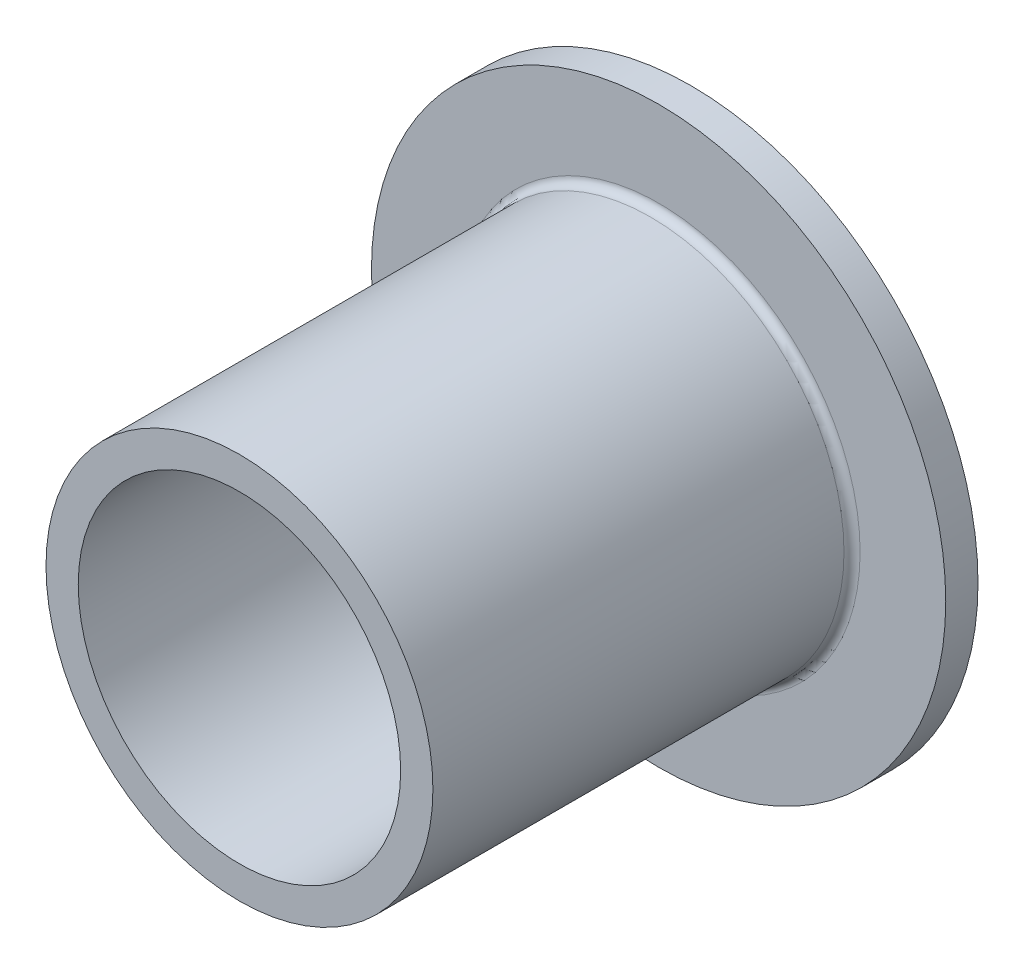
ISO-10303-21;
HEADER;
FILE_DESCRIPTION(('STEP AP214'),'2;1');
FILE_NAME('part.step','',(''),(''),'','','');
FILE_SCHEMA(('AUTOMOTIVE_DESIGN { 1 0 10303 214 1 1 1 1 }'));
ENDSEC;
DATA;
#1=APPLICATION_CONTEXT('core data for automotive mechanical design processes');
#2=APPLICATION_PROTOCOL_DEFINITION('international standard','automotive_design',2000,#1);
#3=PRODUCT_CONTEXT('',#1,'mechanical');
#4=PRODUCT('Part','Part','',(#3));
#5=PRODUCT_RELATED_PRODUCT_CATEGORY('part','',(#4));
#6=PRODUCT_DEFINITION_FORMATION('','',#4);
#7=PRODUCT_DEFINITION_CONTEXT('part definition',#1,'design');
#8=PRODUCT_DEFINITION('design','',#6,#7);
#9=PRODUCT_DEFINITION_SHAPE('','',#8);
#10=(LENGTH_UNIT() NAMED_UNIT(*) SI_UNIT(.MILLI.,.METRE.));
#11=(NAMED_UNIT(*) PLANE_ANGLE_UNIT() SI_UNIT($,.RADIAN.));
#12=(NAMED_UNIT(*) SI_UNIT($,.STERADIAN.) SOLID_ANGLE_UNIT());
#13=UNCERTAINTY_MEASURE_WITH_UNIT(LENGTH_MEASURE(1.E-05),#10,'distance_accuracy_value','');
#14=(GEOMETRIC_REPRESENTATION_CONTEXT(3) GLOBAL_UNCERTAINTY_ASSIGNED_CONTEXT((#13)) GLOBAL_UNIT_ASSIGNED_CONTEXT((#10,
#11,#12)) REPRESENTATION_CONTEXT('',''));
#15=CARTESIAN_POINT('',(0.,0.,0.));
#16=DIRECTION('',(0.,0.,1.));
#17=DIRECTION('',(1.,0.,0.));
#18=AXIS2_PLACEMENT_3D('',#15,#16,#17);
#19=CARTESIAN_POINT('',(0.,0.,4.));
#20=DIRECTION('',(0.,0.,1.));
#21=DIRECTION('',(1.,0.,0.));
#22=AXIS2_PLACEMENT_3D('',#19,#20,#21);
#23=PLANE('',#22);
#24=CARTESIAN_POINT('',(0.,0.,4.));
#25=DIRECTION('',(0.,0.,1.));
#26=DIRECTION('',(1.,0.,0.));
#27=AXIS2_PLACEMENT_3D('',#24,#25,#26);
#28=CIRCLE('',#27,25.);
#29=CARTESIAN_POINT('',(25.,0.,4.));
#30=VERTEX_POINT('',#29);
#31=EDGE_CURVE('E10',#30,#30,#28,.F.);
#32=ORIENTED_EDGE('',*,*,#31,.T.);
#33=EDGE_LOOP('',(#32));
#34=FACE_BOUND('',#33,.T.);
#35=CARTESIAN_POINT('',(0.,0.,4.));
#36=DIRECTION('',(0.,0.,1.));
#37=DIRECTION('',(1.,0.,0.));
#38=AXIS2_PLACEMENT_3D('',#35,#36,#37);
#39=CIRCLE('',#38,35.625);
#40=CARTESIAN_POINT('',(35.625,0.,4.));
#41=VERTEX_POINT('',#40);
#42=EDGE_CURVE('E50',#41,#41,#39,.T.);
#43=ORIENTED_EDGE('',*,*,#42,.T.);
#44=EDGE_LOOP('',(#43));
#45=FACE_BOUND('',#44,.T.);
#46=ADVANCED_FACE('F39',(#34,#45),#23,.T.);
#47=CARTESIAN_POINT('',(0.,0.,0.));
#48=DIRECTION('',(0.,0.,1.));
#49=DIRECTION('',(1.,0.,0.));
#50=AXIS2_PLACEMENT_3D('',#47,#48,#49);
#51=PLANE('',#50);
#52=CARTESIAN_POINT('',(0.,0.,0.));
#53=DIRECTION('',(0.,0.,1.));
#54=DIRECTION('',(1.,0.,0.));
#55=AXIS2_PLACEMENT_3D('',#52,#53,#54);
#56=CIRCLE('',#55,35.625);
#57=CARTESIAN_POINT('',(35.625,0.,0.));
#58=VERTEX_POINT('',#57);
#59=EDGE_CURVE('E54',#58,#58,#56,.T.);
#60=ORIENTED_EDGE('',*,*,#59,.F.);
#61=EDGE_LOOP('',(#60));
#62=FACE_BOUND('',#61,.T.);
#63=CARTESIAN_POINT('',(0.,0.,0.));
#64=DIRECTION('',(0.,0.,1.));
#65=DIRECTION('',(1.,0.,0.));
#66=AXIS2_PLACEMENT_3D('',#63,#64,#65);
#67=CIRCLE('',#66,20.);
#68=CARTESIAN_POINT('',(20.,0.,0.));
#69=VERTEX_POINT('',#68);
#70=EDGE_CURVE('E58',#69,#69,#67,.T.);
#71=ORIENTED_EDGE('',*,*,#70,.T.);
#72=EDGE_LOOP('',(#71));
#73=FACE_BOUND('',#72,.T.);
#74=ADVANCED_FACE('F85',(#62,#73),#51,.F.);
#75=CARTESIAN_POINT('',(0.,0.,4.));
#76=DIRECTION('',(0.,0.,-1.));
#77=DIRECTION('',(-1.,0.,0.));
#78=AXIS2_PLACEMENT_3D('',#75,#76,#77);
#79=CYLINDRICAL_SURFACE('',#78,35.625);
#80=ORIENTED_EDGE('',*,*,#42,.F.);
#81=EDGE_LOOP('',(#80));
#82=FACE_BOUND('',#81,.T.);
#83=ORIENTED_EDGE('',*,*,#59,.T.);
#84=EDGE_LOOP('',(#83));
#85=FACE_BOUND('',#84,.T.);
#86=ADVANCED_FACE('F82',(#82,#85),#79,.T.);
#87=CARTESIAN_POINT('',(0.,0.,4.));
#88=DIRECTION('',(0.,0.,-1.));
#89=DIRECTION('',(-1.,0.,0.));
#90=AXIS2_PLACEMENT_3D('',#87,#88,#89);
#91=CYLINDRICAL_SURFACE('',#90,20.);
#92=ORIENTED_EDGE('',*,*,#70,.F.);
#93=EDGE_LOOP('',(#92));
#94=FACE_BOUND('',#93,.T.);
#95=CARTESIAN_POINT('',(0.,0.,56.));
#96=DIRECTION('',(0.,0.,1.));
#97=DIRECTION('',(1.,0.,0.));
#98=AXIS2_PLACEMENT_3D('',#95,#96,#97);
#99=CIRCLE('',#98,20.);
#100=CARTESIAN_POINT('',(20.,0.,56.));
#101=VERTEX_POINT('',#100);
#102=EDGE_CURVE('E65',#101,#101,#99,.T.);
#103=ORIENTED_EDGE('',*,*,#102,.T.);
#104=EDGE_LOOP('',(#103));
#105=FACE_BOUND('',#104,.T.);
#106=ADVANCED_FACE('F69',(#94,#105),#91,.F.);
#107=CARTESIAN_POINT('',(0.,0.,56.));
#108=DIRECTION('',(0.,0.,1.));
#109=DIRECTION('',(1.,0.,0.));
#110=AXIS2_PLACEMENT_3D('',#107,#108,#109);
#111=PLANE('',#110);
#112=CARTESIAN_POINT('',(0.,0.,56.));
#113=DIRECTION('',(0.,0.,1.));
#114=DIRECTION('',(1.,0.,0.));
#115=AXIS2_PLACEMENT_3D('',#112,#113,#114);
#116=CIRCLE('',#115,24.);
#117=CARTESIAN_POINT('',(-24.,0.,56.));
#118=VERTEX_POINT('',#117);
#119=EDGE_CURVE('E62',#118,#118,#116,.T.);
#120=ORIENTED_EDGE('',*,*,#119,.T.);
#121=EDGE_LOOP('',(#120));
#122=FACE_BOUND('',#121,.T.);
#123=ORIENTED_EDGE('',*,*,#102,.F.);
#124=EDGE_LOOP('',(#123));
#125=FACE_BOUND('',#124,.T.);
#126=ADVANCED_FACE('F71',(#122,#125),#111,.T.);
#127=CARTESIAN_POINT('',(0.,0.,56.));
#128=DIRECTION('',(0.,0.,-1.));
#129=DIRECTION('',(-1.,0.,0.));
#130=AXIS2_PLACEMENT_3D('',#127,#128,#129);
#131=CYLINDRICAL_SURFACE('',#130,24.);
#132=CARTESIAN_POINT('',(0.,0.,5.));
#133=DIRECTION('',(0.,0.,1.));
#134=DIRECTION('',(1.,0.,0.));
#135=AXIS2_PLACEMENT_3D('',#132,#133,#134);
#136=CIRCLE('',#135,24.);
#137=CARTESIAN_POINT('',(-24.,0.,5.));
#138=VERTEX_POINT('',#137);
#139=EDGE_CURVE('E46',#138,#138,#136,.T.);
#140=CARTESIAN_POINT('',(-24.,0.,5.));
#141=CARTESIAN_POINT('',(-24.,0.,5.53125));
#142=CARTESIAN_POINT('',(-24.,0.,6.0625));
#143=CARTESIAN_POINT('',(-24.,0.,7.125));
#144=CARTESIAN_POINT('',(-24.,0.,7.65625));
#145=CARTESIAN_POINT('',(-24.,0.,8.71875));
#146=CARTESIAN_POINT('',(-24.,0.,9.25));
#147=CARTESIAN_POINT('',(-24.,0.,10.3125));
#148=CARTESIAN_POINT('',(-24.,0.,10.84375));
#149=CARTESIAN_POINT('',(-24.,0.,11.90625));
#150=CARTESIAN_POINT('',(-24.,0.,12.4375));
#151=CARTESIAN_POINT('',(-24.,0.,13.5));
#152=CARTESIAN_POINT('',(-24.,0.,14.03125));
#153=CARTESIAN_POINT('',(-24.,0.,15.09375));
#154=CARTESIAN_POINT('',(-24.,0.,15.625));
#155=CARTESIAN_POINT('',(-24.,0.,16.6875));
#156=CARTESIAN_POINT('',(-24.,0.,17.21875));
#157=CARTESIAN_POINT('',(-24.,0.,18.28125));
#158=CARTESIAN_POINT('',(-24.,0.,18.8125));
#159=CARTESIAN_POINT('',(-24.,0.,19.875));
#160=CARTESIAN_POINT('',(-24.,0.,20.40625));
#161=CARTESIAN_POINT('',(-24.,0.,21.46875));
#162=CARTESIAN_POINT('',(-24.,0.,22.));
#163=CARTESIAN_POINT('',(-24.,0.,23.0625));
#164=CARTESIAN_POINT('',(-24.,0.,23.59375));
#165=CARTESIAN_POINT('',(-24.,0.,24.65625));
#166=CARTESIAN_POINT('',(-24.,0.,25.1875));
#167=CARTESIAN_POINT('',(-24.,0.,26.25));
#168=CARTESIAN_POINT('',(-24.,0.,26.78125));
#169=CARTESIAN_POINT('',(-24.,0.,27.84375));
#170=CARTESIAN_POINT('',(-24.,0.,28.375));
#171=CARTESIAN_POINT('',(-24.,0.,29.4375));
#172=CARTESIAN_POINT('',(-24.,0.,29.96875));
#173=CARTESIAN_POINT('',(-24.,0.,31.03125));
#174=CARTESIAN_POINT('',(-24.,0.,31.5625));
#175=CARTESIAN_POINT('',(-24.,0.,32.625));
#176=CARTESIAN_POINT('',(-24.,0.,33.15625));
#177=CARTESIAN_POINT('',(-24.,0.,34.21875));
#178=CARTESIAN_POINT('',(-24.,0.,34.75));
#179=CARTESIAN_POINT('',(-24.,0.,35.8125));
#180=CARTESIAN_POINT('',(-24.,0.,36.34375));
#181=CARTESIAN_POINT('',(-24.,0.,37.40625));
#182=CARTESIAN_POINT('',(-24.,0.,37.9375));
#183=CARTESIAN_POINT('',(-24.,0.,39.));
#184=CARTESIAN_POINT('',(-24.,0.,39.53125));
#185=CARTESIAN_POINT('',(-24.,0.,40.59375));
#186=CARTESIAN_POINT('',(-24.,0.,41.125));
#187=CARTESIAN_POINT('',(-24.,0.,42.1875));
#188=CARTESIAN_POINT('',(-24.,0.,42.71875));
#189=CARTESIAN_POINT('',(-24.,0.,43.78125));
#190=CARTESIAN_POINT('',(-24.,0.,44.3125));
#191=CARTESIAN_POINT('',(-24.,0.,45.375));
#192=CARTESIAN_POINT('',(-24.,0.,45.90625));
#193=CARTESIAN_POINT('',(-24.,0.,46.96875));
#194=CARTESIAN_POINT('',(-24.,0.,47.5));
#195=CARTESIAN_POINT('',(-24.,0.,48.5625));
#196=CARTESIAN_POINT('',(-24.,0.,49.09375));
#197=CARTESIAN_POINT('',(-24.,0.,50.15625));
#198=CARTESIAN_POINT('',(-24.,0.,50.6875));
#199=CARTESIAN_POINT('',(-24.,0.,51.75));
#200=CARTESIAN_POINT('',(-24.,0.,52.28125));
#201=CARTESIAN_POINT('',(-24.,0.,53.34375));
#202=CARTESIAN_POINT('',(-24.,0.,53.875));
#203=CARTESIAN_POINT('',(-24.,0.,54.9375));
#204=CARTESIAN_POINT('',(-24.,0.,55.46875));
#205=CARTESIAN_POINT('',(-24.,0.,56.));
#206=B_SPLINE_CURVE_WITH_KNOTS('',3,(#140,#141,#142,#143,#144,#145,#146,#147,#148,#149,#150,
#151,#152,#153,#154,#155,#156,#157,#158,#159,#160,#161,#162,#163,#164,#165,#166,#167,#168,#169,
#170,#171,#172,#173,#174,#175,#176,#177,#178,#179,#180,#181,#182,#183,#184,#185,#186,#187,#188,
#189,#190,#191,#192,#193,#194,#195,#196,#197,#198,#199,#200,#201,#202,#203,#204,#205),
.UNSPECIFIED.,.F.,.F.,(4,2,2,2,2,2,2,2,2,2,2,2,2,2,2,2,2,2,2,2,2,2,2,2,2,2,2,2,2,2,2,2,4),(0.,
1.59375,3.1875,4.78125,6.375,7.96875,9.5625,11.15625,12.75,14.34375,15.9375,17.53125,19.125,
20.71875,22.3125,23.90625,25.5,27.09375,28.6875,30.28125,31.875,33.46875,35.0625,36.65625,38.25,
39.84375,41.4375,43.03125,44.625,46.21875,47.8125,49.40625,51.),.UNSPECIFIED.);
#207=EDGE_CURVE('BSEAM73',#138,#118,#206,.T.);
#208=ORIENTED_EDGE('',*,*,#139,.T.);
#209=ORIENTED_EDGE('',*,*,#119,.F.);
#210=ORIENTED_EDGE('',*,*,#207,.T.);
#211=ORIENTED_EDGE('',*,*,#207,.F.);
#212=EDGE_LOOP('',(#208,#210,#209,#211));
#213=FACE_BOUND('',#212,.T.);
#214=ADVANCED_FACE('F73',(#213),#131,.T.);
#215=CARTESIAN_POINT('',(0.,0.,5.));
#216=DIRECTION('',(0.,0.,1.));
#217=DIRECTION('',(1.,0.,0.));
#218=AXIS2_PLACEMENT_3D('',#215,#216,#217);
#219=TOROIDAL_SURFACE('',#218,25.,1.);
#220=ORIENTED_EDGE('',*,*,#31,.F.);
#221=EDGE_LOOP('',(#220));
#222=FACE_BOUND('',#221,.T.);
#223=ORIENTED_EDGE('',*,*,#139,.F.);
#224=EDGE_LOOP('',(#223));
#225=FACE_BOUND('',#224,.T.);
#226=ADVANCED_FACE('F41',(#222,#225),#219,.F.);
#227=CLOSED_SHELL('',(#46,#74,#86,#106,#126,#214,#226));
#228=MANIFOLD_SOLID_BREP('B2',#227);
#229=ADVANCED_BREP_SHAPE_REPRESENTATION('',(#18,#228),#14);
#230=SHAPE_DEFINITION_REPRESENTATION(#9,#229);
ENDSEC;
END-ISO-10303-21;
